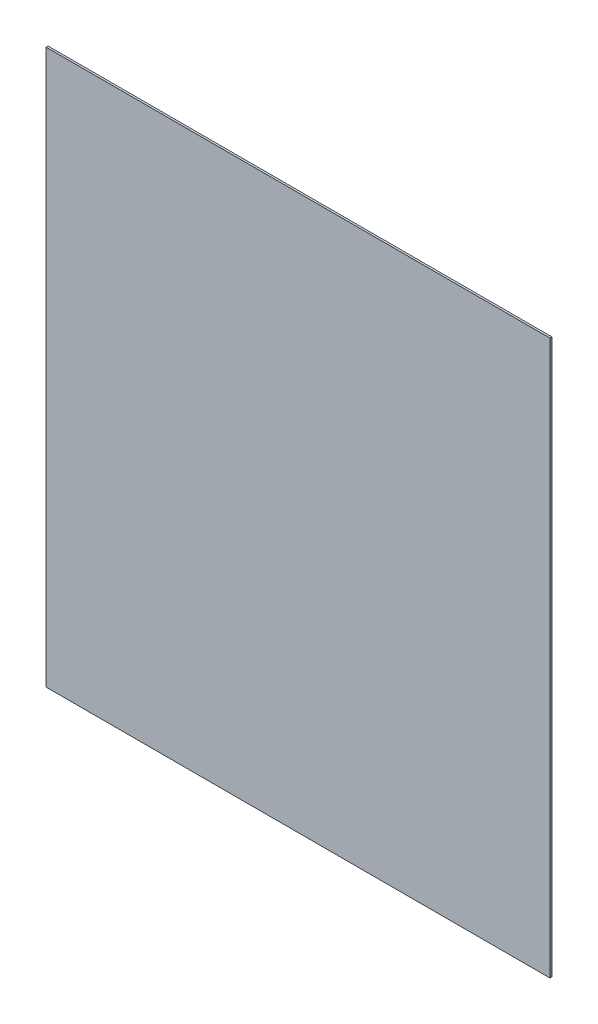
ISO-10303-21;
HEADER;
FILE_DESCRIPTION(('STEP AP214'),'2;1');
FILE_NAME('part.step','',(''),(''),'','','');
FILE_SCHEMA(('AUTOMOTIVE_DESIGN { 1 0 10303 214 1 1 1 1 }'));
ENDSEC;
DATA;
#1=APPLICATION_CONTEXT('core data for automotive mechanical design processes');
#2=APPLICATION_PROTOCOL_DEFINITION('international standard','automotive_design',2000,#1);
#3=PRODUCT_CONTEXT('',#1,'mechanical');
#4=PRODUCT('Part','Part','',(#3));
#5=PRODUCT_RELATED_PRODUCT_CATEGORY('part','',(#4));
#6=PRODUCT_DEFINITION_FORMATION('','',#4);
#7=PRODUCT_DEFINITION_CONTEXT('part definition',#1,'design');
#8=PRODUCT_DEFINITION('design','',#6,#7);
#9=PRODUCT_DEFINITION_SHAPE('','',#8);
#10=(LENGTH_UNIT() NAMED_UNIT(*) SI_UNIT(.MILLI.,.METRE.));
#11=(NAMED_UNIT(*) PLANE_ANGLE_UNIT() SI_UNIT($,.RADIAN.));
#12=(NAMED_UNIT(*) SI_UNIT($,.STERADIAN.) SOLID_ANGLE_UNIT());
#13=UNCERTAINTY_MEASURE_WITH_UNIT(LENGTH_MEASURE(1.E-05),#10,'distance_accuracy_value','');
#14=(GEOMETRIC_REPRESENTATION_CONTEXT(3) GLOBAL_UNCERTAINTY_ASSIGNED_CONTEXT((#13)) GLOBAL_UNIT_ASSIGNED_CONTEXT((#10,
#11,#12)) REPRESENTATION_CONTEXT('',''));
#15=CARTESIAN_POINT('',(0.,0.,0.));
#16=DIRECTION('',(0.,0.,1.));
#17=DIRECTION('',(1.,0.,0.));
#18=AXIS2_PLACEMENT_3D('',#15,#16,#17);
#19=CARTESIAN_POINT('',(-250.,-275.,1.));
#20=DIRECTION('',(1.,0.,0.));
#21=DIRECTION('',(0.,0.,-1.));
#22=AXIS2_PLACEMENT_3D('',#19,#20,#21);
#23=PLANE('',#22);
#24=DIRECTION('',(0.,-1.,0.));
#25=VECTOR('',#24,1.);
#26=CARTESIAN_POINT('',(-250.,-275.,-1.));
#27=LINE('',#26,#25);
#28=CARTESIAN_POINT('',(-250.,275.,-1.));
#29=VERTEX_POINT('',#28);
#30=CARTESIAN_POINT('',(-250.,-275.,-1.));
#31=VERTEX_POINT('',#30);
#32=EDGE_CURVE('E100',#29,#31,#27,.T.);
#33=ORIENTED_EDGE('',*,*,#32,.T.);
#34=DIRECTION('',(0.,0.,-1.));
#35=VECTOR('',#34,1.);
#36=CARTESIAN_POINT('',(-250.,-275.,1.));
#37=LINE('',#36,#35);
#38=CARTESIAN_POINT('',(-250.,-275.,1.));
#39=VERTEX_POINT('',#38);
#40=EDGE_CURVE('E11',#39,#31,#37,.T.);
#41=ORIENTED_EDGE('',*,*,#40,.F.);
#42=DIRECTION('',(0.,-1.,0.));
#43=VECTOR('',#42,1.);
#44=CARTESIAN_POINT('',(-250.,-275.,1.));
#45=LINE('',#44,#43);
#46=CARTESIAN_POINT('',(-250.,275.,1.));
#47=VERTEX_POINT('',#46);
#48=EDGE_CURVE('E88',#47,#39,#45,.T.);
#49=ORIENTED_EDGE('',*,*,#48,.F.);
#50=DIRECTION('',(0.,0.,-1.));
#51=VECTOR('',#50,1.);
#52=CARTESIAN_POINT('',(-250.,275.,1.));
#53=LINE('',#52,#51);
#54=EDGE_CURVE('E96',#47,#29,#53,.T.);
#55=ORIENTED_EDGE('',*,*,#54,.T.);
#56=EDGE_LOOP('',(#33,#41,#49,#55));
#57=FACE_BOUND('',#56,.T.);
#58=ADVANCED_FACE('F37',(#57),#23,.F.);
#59=CARTESIAN_POINT('',(250.,-275.,1.));
#60=DIRECTION('',(0.,1.,0.));
#61=DIRECTION('',(0.,0.,1.));
#62=AXIS2_PLACEMENT_3D('',#59,#60,#61);
#63=PLANE('',#62);
#64=DIRECTION('',(1.,0.,0.));
#65=VECTOR('',#64,1.);
#66=CARTESIAN_POINT('',(250.,-275.,-1.));
#67=LINE('',#66,#65);
#68=CARTESIAN_POINT('',(250.,-275.,-1.));
#69=VERTEX_POINT('',#68);
#70=EDGE_CURVE('E92',#31,#69,#67,.T.);
#71=ORIENTED_EDGE('',*,*,#70,.T.);
#72=DIRECTION('',(0.,0.,-1.));
#73=VECTOR('',#72,1.);
#74=CARTESIAN_POINT('',(250.,-275.,1.));
#75=LINE('',#74,#73);
#76=CARTESIAN_POINT('',(250.,-275.,1.));
#77=VERTEX_POINT('',#76);
#78=EDGE_CURVE('E45',#77,#69,#75,.T.);
#79=ORIENTED_EDGE('',*,*,#78,.F.);
#80=DIRECTION('',(1.,0.,0.));
#81=VECTOR('',#80,1.);
#82=CARTESIAN_POINT('',(250.,-275.,1.));
#83=LINE('',#82,#81);
#84=EDGE_CURVE('E83',#39,#77,#83,.T.);
#85=ORIENTED_EDGE('',*,*,#84,.F.);
#86=ORIENTED_EDGE('',*,*,#40,.T.);
#87=EDGE_LOOP('',(#71,#79,#85,#86));
#88=FACE_BOUND('',#87,.T.);
#89=ADVANCED_FACE('F91',(#88),#63,.F.);
#90=CARTESIAN_POINT('',(250.,-275.,1.));
#91=DIRECTION('',(-1.,0.,0.));
#92=DIRECTION('',(0.,0.,1.));
#93=AXIS2_PLACEMENT_3D('',#90,#91,#92);
#94=PLANE('',#93);
#95=DIRECTION('',(0.,1.,0.));
#96=VECTOR('',#95,1.);
#97=CARTESIAN_POINT('',(250.,-275.,-1.));
#98=LINE('',#97,#96);
#99=CARTESIAN_POINT('',(250.,275.,-1.));
#100=VERTEX_POINT('',#99);
#101=EDGE_CURVE('E70',#69,#100,#98,.T.);
#102=ORIENTED_EDGE('',*,*,#101,.T.);
#103=DIRECTION('',(0.,0.,-1.));
#104=VECTOR('',#103,1.);
#105=CARTESIAN_POINT('',(250.,275.,1.));
#106=LINE('',#105,#104);
#107=CARTESIAN_POINT('',(250.,275.,1.));
#108=VERTEX_POINT('',#107);
#109=EDGE_CURVE('E93',#108,#100,#106,.T.);
#110=ORIENTED_EDGE('',*,*,#109,.F.);
#111=DIRECTION('',(0.,1.,0.));
#112=VECTOR('',#111,1.);
#113=CARTESIAN_POINT('',(250.,-275.,1.));
#114=LINE('',#113,#112);
#115=EDGE_CURVE('E86',#77,#108,#114,.T.);
#116=ORIENTED_EDGE('',*,*,#115,.F.);
#117=ORIENTED_EDGE('',*,*,#78,.T.);
#118=EDGE_LOOP('',(#102,#110,#116,#117));
#119=FACE_BOUND('',#118,.T.);
#120=ADVANCED_FACE('F94',(#119),#94,.F.);
#121=CARTESIAN_POINT('',(250.,275.,1.));
#122=DIRECTION('',(0.,-1.,0.));
#123=DIRECTION('',(0.,0.,-1.));
#124=AXIS2_PLACEMENT_3D('',#121,#122,#123);
#125=PLANE('',#124);
#126=DIRECTION('',(-1.,0.,0.));
#127=VECTOR('',#126,1.);
#128=CARTESIAN_POINT('',(250.,275.,-1.));
#129=LINE('',#128,#127);
#130=EDGE_CURVE('E76',#100,#29,#129,.T.);
#131=ORIENTED_EDGE('',*,*,#130,.T.);
#132=ORIENTED_EDGE('',*,*,#54,.F.);
#133=DIRECTION('',(-1.,0.,0.));
#134=VECTOR('',#133,1.);
#135=CARTESIAN_POINT('',(250.,275.,1.));
#136=LINE('',#135,#134);
#137=EDGE_CURVE('E53',#108,#47,#136,.T.);
#138=ORIENTED_EDGE('',*,*,#137,.F.);
#139=ORIENTED_EDGE('',*,*,#109,.T.);
#140=EDGE_LOOP('',(#131,#132,#138,#139));
#141=FACE_BOUND('',#140,.T.);
#142=ADVANCED_FACE('F107',(#141),#125,.F.);
#143=CARTESIAN_POINT('',(0.,0.,1.));
#144=DIRECTION('',(0.,0.,1.));
#145=DIRECTION('',(1.,0.,0.));
#146=AXIS2_PLACEMENT_3D('',#143,#144,#145);
#147=PLANE('',#146);
#148=ORIENTED_EDGE('',*,*,#48,.T.);
#149=ORIENTED_EDGE('',*,*,#84,.T.);
#150=ORIENTED_EDGE('',*,*,#115,.T.);
#151=ORIENTED_EDGE('',*,*,#137,.T.);
#152=EDGE_LOOP('',(#148,#149,#150,#151));
#153=FACE_BOUND('',#152,.T.);
#154=ADVANCED_FACE('F84',(#153),#147,.T.);
#155=CARTESIAN_POINT('',(0.,0.,-1.));
#156=DIRECTION('',(0.,0.,1.));
#157=DIRECTION('',(1.,0.,0.));
#158=AXIS2_PLACEMENT_3D('',#155,#156,#157);
#159=PLANE('',#158);
#160=ORIENTED_EDGE('',*,*,#32,.F.);
#161=ORIENTED_EDGE('',*,*,#130,.F.);
#162=ORIENTED_EDGE('',*,*,#101,.F.);
#163=ORIENTED_EDGE('',*,*,#70,.F.);
#164=EDGE_LOOP('',(#160,#161,#162,#163));
#165=FACE_BOUND('',#164,.T.);
#166=ADVANCED_FACE('F110',(#165),#159,.F.);
#167=CLOSED_SHELL('',(#58,#89,#120,#142,#154,#166));
#168=MANIFOLD_SOLID_BREP('B2',#167);
#169=ADVANCED_BREP_SHAPE_REPRESENTATION('',(#18,#168),#14);
#170=SHAPE_DEFINITION_REPRESENTATION(#9,#169);
ENDSEC;
END-ISO-10303-21;
